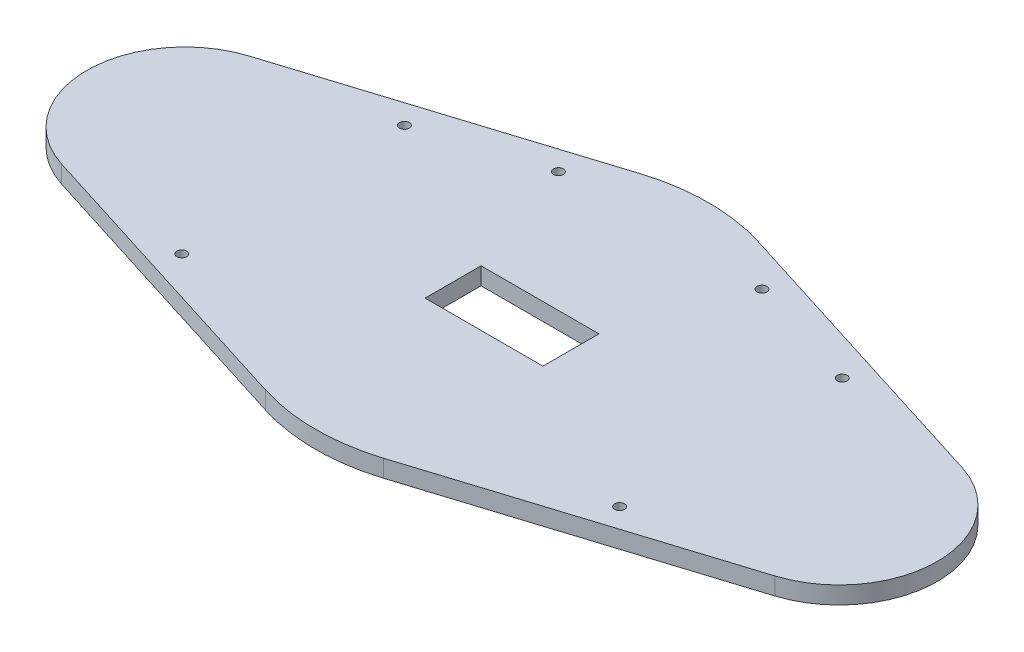
ISO-10303-21;
HEADER;
FILE_DESCRIPTION(('STEP AP214'),'2;1');
FILE_NAME('part.step','',(''),(''),'','','');
FILE_SCHEMA(('AUTOMOTIVE_DESIGN { 1 0 10303 214 1 1 1 1 }'));
ENDSEC;
DATA;
#1=APPLICATION_CONTEXT('core data for automotive mechanical design processes');
#2=APPLICATION_PROTOCOL_DEFINITION('international standard','automotive_design',2000,#1);
#3=PRODUCT_CONTEXT('',#1,'mechanical');
#4=PRODUCT('Part','Part','',(#3));
#5=PRODUCT_RELATED_PRODUCT_CATEGORY('part','',(#4));
#6=PRODUCT_DEFINITION_FORMATION('','',#4);
#7=PRODUCT_DEFINITION_CONTEXT('part definition',#1,'design');
#8=PRODUCT_DEFINITION('design','',#6,#7);
#9=PRODUCT_DEFINITION_SHAPE('','',#8);
#10=(LENGTH_UNIT() NAMED_UNIT(*) SI_UNIT(.MILLI.,.METRE.));
#11=(NAMED_UNIT(*) PLANE_ANGLE_UNIT() SI_UNIT($,.RADIAN.));
#12=(NAMED_UNIT(*) SI_UNIT($,.STERADIAN.) SOLID_ANGLE_UNIT());
#13=UNCERTAINTY_MEASURE_WITH_UNIT(LENGTH_MEASURE(1.E-05),#10,'distance_accuracy_value','');
#14=(GEOMETRIC_REPRESENTATION_CONTEXT(3) GLOBAL_UNCERTAINTY_ASSIGNED_CONTEXT((#13)) GLOBAL_UNIT_ASSIGNED_CONTEXT((#10,
#11,#12)) REPRESENTATION_CONTEXT('',''));
#15=CARTESIAN_POINT('',(0.,0.,0.));
#16=DIRECTION('',(0.,0.,1.));
#17=DIRECTION('',(1.,0.,0.));
#18=AXIS2_PLACEMENT_3D('',#15,#16,#17);
#19=CARTESIAN_POINT('',(-84.582,4.4958,0.));
#20=DIRECTION('',(0.,1.,0.));
#21=DIRECTION('',(0.,0.,1.));
#22=AXIS2_PLACEMENT_3D('',#19,#20,#21);
#23=PLANE('',#22);
#24=CARTESIAN_POINT('',(-26.3141059658633,4.4958,-38.3163692332314));
#25=DIRECTION('',(0.,1.,0.));
#26=DIRECTION('',(0.,0.,1.));
#27=AXIS2_PLACEMENT_3D('',#24,#25,#26);
#28=CIRCLE('',#27,1.27);
#29=CARTESIAN_POINT('',(-26.3141059658633,4.4958,-37.0463692332314));
#30=VERTEX_POINT('',#29);
#31=EDGE_CURVE('E327',#30,#30,#28,.T.);
#32=ORIENTED_EDGE('',*,*,#31,.F.);
#33=EDGE_LOOP('',(#32));
#34=FACE_BOUND('',#33,.T.);
#35=CARTESIAN_POINT('',(56.6033654962808,4.4958,28.7803581370082));
#36=DIRECTION('',(0.,1.,0.));
#37=DIRECTION('',(0.,0.,1.));
#38=AXIS2_PLACEMENT_3D('',#35,#36,#37);
#39=CIRCLE('',#38,1.27);
#40=CARTESIAN_POINT('',(56.6033654962808,4.4958,30.0503581370082));
#41=VERTEX_POINT('',#40);
#42=EDGE_CURVE('E339',#41,#41,#39,.T.);
#43=ORIENTED_EDGE('',*,*,#42,.F.);
#44=EDGE_LOOP('',(#43));
#45=FACE_BOUND('',#44,.T.);
#46=CARTESIAN_POINT('',(-56.6033654962808,4.4958,-28.7803581370082));
#47=DIRECTION('',(0.,1.,0.));
#48=DIRECTION('',(0.,0.,1.));
#49=AXIS2_PLACEMENT_3D('',#46,#47,#48);
#50=CIRCLE('',#49,1.27);
#51=CARTESIAN_POINT('',(-56.6033654962808,4.4958,-27.5103581370082));
#52=VERTEX_POINT('',#51);
#53=EDGE_CURVE('E151',#52,#52,#50,.T.);
#54=ORIENTED_EDGE('',*,*,#53,.F.);
#55=EDGE_LOOP('',(#54));
#56=FACE_BOUND('',#55,.T.);
#57=CARTESIAN_POINT('',(-84.582,4.4958,0.));
#58=DIRECTION('',(0.,1.,0.));
#59=DIRECTION('',(0.,0.,1.));
#60=AXIS2_PLACEMENT_3D('',#57,#58,#59);
#61=CIRCLE('',#60,25.4);
#62=CARTESIAN_POINT('',(-92.2096276276276,4.4958,-24.2276556186159));
#63=VERTEX_POINT('',#62);
#64=CARTESIAN_POINT('',(-92.2096276276276,4.4958,24.2276556186159));
#65=VERTEX_POINT('',#64);
#66=EDGE_CURVE('E161',#63,#65,#61,.T.);
#67=ORIENTED_EDGE('',*,*,#66,.T.);
#68=DIRECTION('',(0.953844709394328,0.,0.3003003003003));
#69=VECTOR('',#68,1.);
#70=CARTESIAN_POINT('',(-92.2096276276276,4.4958,24.2276556186159));
#71=LINE('',#70,#69);
#72=CARTESIAN_POINT('',(-15.2552552552553,4.4958,48.4553112372319));
#73=VERTEX_POINT('',#72);
#74=EDGE_CURVE('E164',#65,#73,#71,.T.);
#75=ORIENTED_EDGE('',*,*,#74,.T.);
#76=CARTESIAN_POINT('',(0.,4.4958,0.));
#77=DIRECTION('',(0.,1.,0.));
#78=DIRECTION('',(0.,0.,1.));
#79=AXIS2_PLACEMENT_3D('',#76,#77,#78);
#80=CIRCLE('',#79,50.8);
#81=CARTESIAN_POINT('',(15.2552552552553,4.4958,48.4553112372318));
#82=VERTEX_POINT('',#81);
#83=EDGE_CURVE('E167',#73,#82,#80,.T.);
#84=ORIENTED_EDGE('',*,*,#83,.T.);
#85=DIRECTION('',(0.953844709394328,0.,-0.3003003003003));
#86=VECTOR('',#85,1.);
#87=CARTESIAN_POINT('',(92.2096276276276,4.4958,24.2276556186159));
#88=LINE('',#87,#86);
#89=CARTESIAN_POINT('',(92.2096276276276,4.4958,24.2276556186159));
#90=VERTEX_POINT('',#89);
#91=EDGE_CURVE('E169',#82,#90,#88,.T.);
#92=ORIENTED_EDGE('',*,*,#91,.T.);
#93=CARTESIAN_POINT('',(84.582,4.4958,0.));
#94=DIRECTION('',(0.,1.,0.));
#95=DIRECTION('',(0.,0.,1.));
#96=AXIS2_PLACEMENT_3D('',#93,#94,#95);
#97=CIRCLE('',#96,25.4);
#98=CARTESIAN_POINT('',(92.2096276276276,4.4958,-24.2276556186159));
#99=VERTEX_POINT('',#98);
#100=EDGE_CURVE('E171',#90,#99,#97,.T.);
#101=ORIENTED_EDGE('',*,*,#100,.T.);
#102=DIRECTION('',(-0.953844709394328,0.,-0.3003003003003));
#103=VECTOR('',#102,1.);
#104=CARTESIAN_POINT('',(92.2096276276276,4.4958,-24.2276556186159));
#105=LINE('',#104,#103);
#106=CARTESIAN_POINT('',(15.2552552552552,4.4958,-48.4553112372318));
#107=VERTEX_POINT('',#106);
#108=EDGE_CURVE('E173',#99,#107,#105,.T.);
#109=ORIENTED_EDGE('',*,*,#108,.T.);
#110=CARTESIAN_POINT('',(0.,4.4958,0.));
#111=DIRECTION('',(0.,1.,0.));
#112=DIRECTION('',(0.,0.,1.));
#113=AXIS2_PLACEMENT_3D('',#110,#111,#112);
#114=CIRCLE('',#113,50.8);
#115=CARTESIAN_POINT('',(-15.2552552552553,4.4958,-48.4553112372319));
#116=VERTEX_POINT('',#115);
#117=EDGE_CURVE('E175',#107,#116,#114,.T.);
#118=ORIENTED_EDGE('',*,*,#117,.T.);
#119=DIRECTION('',(-0.953844709394328,0.,0.3003003003003));
#120=VECTOR('',#119,1.);
#121=CARTESIAN_POINT('',(-92.2096276276276,4.4958,-24.2276556186159));
#122=LINE('',#121,#120);
#123=EDGE_CURVE('E177',#116,#63,#122,.T.);
#124=ORIENTED_EDGE('',*,*,#123,.T.);
#125=EDGE_LOOP('',(#67,#75,#84,#92,#101,#109,#118,#124));
#126=FACE_BOUND('',#125,.T.);
#127=DIRECTION('',(1.,0.,0.));
#128=VECTOR('',#127,1.);
#129=CARTESIAN_POINT('',(-15.24,4.4958,7.239));
#130=LINE('',#129,#128);
#131=CARTESIAN_POINT('',(-15.24,4.4958,7.239));
#132=VERTEX_POINT('',#131);
#133=CARTESIAN_POINT('',(15.24,4.4958,7.239));
#134=VERTEX_POINT('',#133);
#135=EDGE_CURVE('E130',#132,#134,#130,.T.);
#136=ORIENTED_EDGE('',*,*,#135,.F.);
#137=DIRECTION('',(0.,0.,1.));
#138=VECTOR('',#137,1.);
#139=CARTESIAN_POINT('',(-15.24,4.4958,-7.239));
#140=LINE('',#139,#138);
#141=CARTESIAN_POINT('',(-15.24,4.4958,-7.239));
#142=VERTEX_POINT('',#141);
#143=EDGE_CURVE('E122',#142,#132,#140,.T.);
#144=ORIENTED_EDGE('',*,*,#143,.F.);
#145=DIRECTION('',(-1.,0.,0.));
#146=VECTOR('',#145,1.);
#147=CARTESIAN_POINT('',(-15.24,4.4958,-7.239));
#148=LINE('',#147,#146);
#149=CARTESIAN_POINT('',(15.24,4.4958,-7.239));
#150=VERTEX_POINT('',#149);
#151=EDGE_CURVE('E145',#150,#142,#148,.T.);
#152=ORIENTED_EDGE('',*,*,#151,.F.);
#153=DIRECTION('',(0.,0.,-1.));
#154=VECTOR('',#153,1.);
#155=CARTESIAN_POINT('',(15.24,4.4958,-7.239));
#156=LINE('',#155,#154);
#157=EDGE_CURVE('E143',#134,#150,#156,.T.);
#158=ORIENTED_EDGE('',*,*,#157,.F.);
#159=EDGE_LOOP('',(#136,#144,#152,#158));
#160=FACE_BOUND('',#159,.T.);
#161=CARTESIAN_POINT('',(-56.6033654962808,4.4958,28.7803581370082));
#162=DIRECTION('',(0.,1.,0.));
#163=DIRECTION('',(0.,0.,1.));
#164=AXIS2_PLACEMENT_3D('',#161,#162,#163);
#165=CIRCLE('',#164,1.27);
#166=CARTESIAN_POINT('',(-56.6033654962808,4.4958,30.0503581370082));
#167=VERTEX_POINT('',#166);
#168=EDGE_CURVE('E345',#167,#167,#165,.T.);
#169=ORIENTED_EDGE('',*,*,#168,.F.);
#170=EDGE_LOOP('',(#169));
#171=FACE_BOUND('',#170,.T.);
#172=CARTESIAN_POINT('',(56.6033654962808,4.4958,-28.7803581370082));
#173=DIRECTION('',(0.,1.,0.));
#174=DIRECTION('',(0.,0.,1.));
#175=AXIS2_PLACEMENT_3D('',#172,#173,#174);
#176=CIRCLE('',#175,1.27);
#177=CARTESIAN_POINT('',(56.6033654962808,4.4958,-27.5103581370082));
#178=VERTEX_POINT('',#177);
#179=EDGE_CURVE('E333',#178,#178,#176,.T.);
#180=ORIENTED_EDGE('',*,*,#179,.F.);
#181=EDGE_LOOP('',(#180));
#182=FACE_BOUND('',#181,.T.);
#183=CARTESIAN_POINT('',(26.3141059658633,4.4958,-38.3163692332314));
#184=DIRECTION('',(0.,1.,0.));
#185=DIRECTION('',(0.,0.,1.));
#186=AXIS2_PLACEMENT_3D('',#183,#184,#185);
#187=CIRCLE('',#186,1.27);
#188=CARTESIAN_POINT('',(26.3141059658633,4.4958,-37.0463692332314));
#189=VERTEX_POINT('',#188);
#190=EDGE_CURVE('E318',#189,#189,#187,.T.);
#191=ORIENTED_EDGE('',*,*,#190,.F.);
#192=EDGE_LOOP('',(#191));
#193=FACE_BOUND('',#192,.T.);
#194=ADVANCED_FACE('F33',(#34,#45,#56,#126,#160,#171,#182,#193),#23,.T.);
#195=CARTESIAN_POINT('',(-84.582,0.,0.));
#196=DIRECTION('',(0.,1.,0.));
#197=DIRECTION('',(0.,0.,1.));
#198=AXIS2_PLACEMENT_3D('',#195,#196,#197);
#199=PLANE('',#198);
#200=CARTESIAN_POINT('',(-84.582,0.,0.));
#201=DIRECTION('',(0.,1.,0.));
#202=DIRECTION('',(0.,0.,1.));
#203=AXIS2_PLACEMENT_3D('',#200,#201,#202);
#204=CIRCLE('',#203,25.4);
#205=CARTESIAN_POINT('',(-92.2096276276276,0.,-24.2276556186159));
#206=VERTEX_POINT('',#205);
#207=CARTESIAN_POINT('',(-92.2096276276276,0.,24.2276556186159));
#208=VERTEX_POINT('',#207);
#209=EDGE_CURVE('E138',#206,#208,#204,.T.);
#210=ORIENTED_EDGE('',*,*,#209,.F.);
#211=DIRECTION('',(-0.953844709394328,0.,0.3003003003003));
#212=VECTOR('',#211,1.);
#213=CARTESIAN_POINT('',(-92.2096276276276,0.,-24.2276556186159));
#214=LINE('',#213,#212);
#215=CARTESIAN_POINT('',(-15.2552552552553,0.,-48.4553112372319));
#216=VERTEX_POINT('',#215);
#217=EDGE_CURVE('E165',#216,#206,#214,.T.);
#218=ORIENTED_EDGE('',*,*,#217,.F.);
#219=CARTESIAN_POINT('',(0.,0.,0.));
#220=DIRECTION('',(0.,1.,0.));
#221=DIRECTION('',(0.,0.,1.));
#222=AXIS2_PLACEMENT_3D('',#219,#220,#221);
#223=CIRCLE('',#222,50.8);
#224=CARTESIAN_POINT('',(15.2552552552552,0.,-48.4553112372318));
#225=VERTEX_POINT('',#224);
#226=EDGE_CURVE('E192',#225,#216,#223,.T.);
#227=ORIENTED_EDGE('',*,*,#226,.F.);
#228=DIRECTION('',(-0.953844709394328,0.,-0.3003003003003));
#229=VECTOR('',#228,1.);
#230=CARTESIAN_POINT('',(92.2096276276276,0.,-24.2276556186159));
#231=LINE('',#230,#229);
#232=CARTESIAN_POINT('',(92.2096276276276,0.,-24.2276556186159));
#233=VERTEX_POINT('',#232);
#234=EDGE_CURVE('E190',#233,#225,#231,.T.);
#235=ORIENTED_EDGE('',*,*,#234,.F.);
#236=CARTESIAN_POINT('',(84.582,0.,0.));
#237=DIRECTION('',(0.,1.,0.));
#238=DIRECTION('',(0.,0.,1.));
#239=AXIS2_PLACEMENT_3D('',#236,#237,#238);
#240=CIRCLE('',#239,25.4);
#241=CARTESIAN_POINT('',(92.2096276276276,0.,24.2276556186159));
#242=VERTEX_POINT('',#241);
#243=EDGE_CURVE('E188',#242,#233,#240,.T.);
#244=ORIENTED_EDGE('',*,*,#243,.F.);
#245=DIRECTION('',(0.953844709394328,0.,-0.3003003003003));
#246=VECTOR('',#245,1.);
#247=CARTESIAN_POINT('',(92.2096276276276,0.,24.2276556186159));
#248=LINE('',#247,#246);
#249=CARTESIAN_POINT('',(15.2552552552553,0.,48.4553112372318));
#250=VERTEX_POINT('',#249);
#251=EDGE_CURVE('E186',#250,#242,#248,.T.);
#252=ORIENTED_EDGE('',*,*,#251,.F.);
#253=CARTESIAN_POINT('',(0.,0.,0.));
#254=DIRECTION('',(0.,1.,0.));
#255=DIRECTION('',(0.,0.,1.));
#256=AXIS2_PLACEMENT_3D('',#253,#254,#255);
#257=CIRCLE('',#256,50.8);
#258=CARTESIAN_POINT('',(-15.2552552552553,0.,48.4553112372319));
#259=VERTEX_POINT('',#258);
#260=EDGE_CURVE('E184',#259,#250,#257,.T.);
#261=ORIENTED_EDGE('',*,*,#260,.F.);
#262=DIRECTION('',(0.953844709394328,0.,0.3003003003003));
#263=VECTOR('',#262,1.);
#264=CARTESIAN_POINT('',(-92.2096276276276,0.,24.2276556186159));
#265=LINE('',#264,#263);
#266=EDGE_CURVE('E182',#208,#259,#265,.T.);
#267=ORIENTED_EDGE('',*,*,#266,.F.);
#268=EDGE_LOOP('',(#210,#218,#227,#235,#244,#252,#261,#267));
#269=FACE_BOUND('',#268,.T.);
#270=DIRECTION('',(0.,0.,1.));
#271=VECTOR('',#270,1.);
#272=CARTESIAN_POINT('',(-15.24,0.,-7.239));
#273=LINE('',#272,#271);
#274=CARTESIAN_POINT('',(-15.24,0.,-7.239));
#275=VERTEX_POINT('',#274);
#276=CARTESIAN_POINT('',(-15.24,0.,7.239));
#277=VERTEX_POINT('',#276);
#278=EDGE_CURVE('E56',#275,#277,#273,.T.);
#279=ORIENTED_EDGE('',*,*,#278,.T.);
#280=DIRECTION('',(1.,0.,0.));
#281=VECTOR('',#280,1.);
#282=CARTESIAN_POINT('',(-15.24,0.,7.239));
#283=LINE('',#282,#281);
#284=CARTESIAN_POINT('',(15.24,0.,7.239));
#285=VERTEX_POINT('',#284);
#286=EDGE_CURVE('E137',#277,#285,#283,.T.);
#287=ORIENTED_EDGE('',*,*,#286,.T.);
#288=DIRECTION('',(0.,0.,-1.));
#289=VECTOR('',#288,1.);
#290=CARTESIAN_POINT('',(15.24,0.,-7.239));
#291=LINE('',#290,#289);
#292=CARTESIAN_POINT('',(15.24,0.,-7.239));
#293=VERTEX_POINT('',#292);
#294=EDGE_CURVE('E153',#285,#293,#291,.T.);
#295=ORIENTED_EDGE('',*,*,#294,.T.);
#296=DIRECTION('',(-1.,0.,0.));
#297=VECTOR('',#296,1.);
#298=CARTESIAN_POINT('',(-15.24,0.,-7.239));
#299=LINE('',#298,#297);
#300=EDGE_CURVE('E131',#293,#275,#299,.T.);
#301=ORIENTED_EDGE('',*,*,#300,.T.);
#302=EDGE_LOOP('',(#279,#287,#295,#301));
#303=FACE_BOUND('',#302,.T.);
#304=CARTESIAN_POINT('',(-56.6033654962808,0.,-28.7803581370082));
#305=DIRECTION('',(0.,1.,0.));
#306=DIRECTION('',(0.,0.,1.));
#307=AXIS2_PLACEMENT_3D('',#304,#305,#306);
#308=CIRCLE('',#307,1.27);
#309=CARTESIAN_POINT('',(-56.6033654962808,0.,-27.5103581370082));
#310=VERTEX_POINT('',#309);
#311=EDGE_CURVE('E348',#310,#310,#308,.T.);
#312=ORIENTED_EDGE('',*,*,#311,.T.);
#313=EDGE_LOOP('',(#312));
#314=FACE_BOUND('',#313,.T.);
#315=CARTESIAN_POINT('',(-56.6033654962808,0.,28.7803581370082));
#316=DIRECTION('',(0.,1.,0.));
#317=DIRECTION('',(0.,0.,1.));
#318=AXIS2_PLACEMENT_3D('',#315,#316,#317);
#319=CIRCLE('',#318,1.27);
#320=CARTESIAN_POINT('',(-56.6033654962808,0.,30.0503581370082));
#321=VERTEX_POINT('',#320);
#322=EDGE_CURVE('E342',#321,#321,#319,.T.);
#323=ORIENTED_EDGE('',*,*,#322,.T.);
#324=EDGE_LOOP('',(#323));
#325=FACE_BOUND('',#324,.T.);
#326=CARTESIAN_POINT('',(56.6033654962808,0.,28.7803581370082));
#327=DIRECTION('',(0.,1.,0.));
#328=DIRECTION('',(0.,0.,1.));
#329=AXIS2_PLACEMENT_3D('',#326,#327,#328);
#330=CIRCLE('',#329,1.27);
#331=CARTESIAN_POINT('',(56.6033654962808,0.,30.0503581370082));
#332=VERTEX_POINT('',#331);
#333=EDGE_CURVE('E336',#332,#332,#330,.T.);
#334=ORIENTED_EDGE('',*,*,#333,.T.);
#335=EDGE_LOOP('',(#334));
#336=FACE_BOUND('',#335,.T.);
#337=CARTESIAN_POINT('',(56.6033654962808,0.,-28.7803581370082));
#338=DIRECTION('',(0.,1.,0.));
#339=DIRECTION('',(0.,0.,1.));
#340=AXIS2_PLACEMENT_3D('',#337,#338,#339);
#341=CIRCLE('',#340,1.27);
#342=CARTESIAN_POINT('',(56.6033654962808,0.,-27.5103581370082));
#343=VERTEX_POINT('',#342);
#344=EDGE_CURVE('E330',#343,#343,#341,.T.);
#345=ORIENTED_EDGE('',*,*,#344,.T.);
#346=EDGE_LOOP('',(#345));
#347=FACE_BOUND('',#346,.T.);
#348=CARTESIAN_POINT('',(-26.3141059658633,0.,-38.3163692332314));
#349=DIRECTION('',(0.,1.,0.));
#350=DIRECTION('',(0.,0.,1.));
#351=AXIS2_PLACEMENT_3D('',#348,#349,#350);
#352=CIRCLE('',#351,1.27);
#353=CARTESIAN_POINT('',(-26.3141059658633,0.,-37.0463692332314));
#354=VERTEX_POINT('',#353);
#355=EDGE_CURVE('E324',#354,#354,#352,.T.);
#356=ORIENTED_EDGE('',*,*,#355,.T.);
#357=EDGE_LOOP('',(#356));
#358=FACE_BOUND('',#357,.T.);
#359=CARTESIAN_POINT('',(26.3141059658633,0.,-38.3163692332314));
#360=DIRECTION('',(0.,1.,0.));
#361=DIRECTION('',(0.,0.,1.));
#362=AXIS2_PLACEMENT_3D('',#359,#360,#361);
#363=CIRCLE('',#362,1.27);
#364=CARTESIAN_POINT('',(26.3141059658633,0.,-37.0463692332314));
#365=VERTEX_POINT('',#364);
#366=EDGE_CURVE('E321',#365,#365,#363,.T.);
#367=ORIENTED_EDGE('',*,*,#366,.T.);
#368=EDGE_LOOP('',(#367));
#369=FACE_BOUND('',#368,.T.);
#370=ADVANCED_FACE('F222',(#269,#303,#314,#325,#336,#347,#358,#369),#199,.F.);
#371=CARTESIAN_POINT('',(-84.582,4.4958,0.));
#372=DIRECTION('',(0.,-1.,0.));
#373=DIRECTION('',(0.,0.,-1.));
#374=AXIS2_PLACEMENT_3D('',#371,#372,#373);
#375=CYLINDRICAL_SURFACE('',#374,25.4);
#376=ORIENTED_EDGE('',*,*,#209,.T.);
#377=DIRECTION('',(0.,-1.,0.));
#378=VECTOR('',#377,1.);
#379=CARTESIAN_POINT('',(-92.2096276276276,4.4958,24.2276556186159));
#380=LINE('',#379,#378);
#381=EDGE_CURVE('E11',#65,#208,#380,.T.);
#382=ORIENTED_EDGE('',*,*,#381,.F.);
#383=ORIENTED_EDGE('',*,*,#66,.F.);
#384=DIRECTION('',(0.,-1.,0.));
#385=VECTOR('',#384,1.);
#386=CARTESIAN_POINT('',(-92.2096276276276,4.4958,-24.2276556186159));
#387=LINE('',#386,#385);
#388=EDGE_CURVE('E179',#63,#206,#387,.T.);
#389=ORIENTED_EDGE('',*,*,#388,.T.);
#390=EDGE_LOOP('',(#376,#382,#383,#389));
#391=FACE_BOUND('',#390,.T.);
#392=ADVANCED_FACE('F35',(#391),#375,.T.);
#393=CARTESIAN_POINT('',(-92.2096276276276,4.4958,24.2276556186159));
#394=DIRECTION('',(0.3003003003003,0.,-0.953844709394328));
#395=DIRECTION('',(-0.953844709394328,0.,-0.3003003003003));
#396=AXIS2_PLACEMENT_3D('',#393,#394,#395);
#397=PLANE('',#396);
#398=ORIENTED_EDGE('',*,*,#266,.T.);
#399=DIRECTION('',(0.,-1.,0.));
#400=VECTOR('',#399,1.);
#401=CARTESIAN_POINT('',(-15.2552552552553,4.4958,48.4553112372319));
#402=LINE('',#401,#400);
#403=EDGE_CURVE('E41',#73,#259,#402,.T.);
#404=ORIENTED_EDGE('',*,*,#403,.F.);
#405=ORIENTED_EDGE('',*,*,#74,.F.);
#406=ORIENTED_EDGE('',*,*,#381,.T.);
#407=EDGE_LOOP('',(#398,#404,#405,#406));
#408=FACE_BOUND('',#407,.T.);
#409=ADVANCED_FACE('F239',(#408),#397,.F.);
#410=CARTESIAN_POINT('',(0.,4.4958,0.));
#411=DIRECTION('',(0.,-1.,0.));
#412=DIRECTION('',(0.,0.,-1.));
#413=AXIS2_PLACEMENT_3D('',#410,#411,#412);
#414=CYLINDRICAL_SURFACE('',#413,50.8);
#415=ORIENTED_EDGE('',*,*,#260,.T.);
#416=DIRECTION('',(0.,-1.,0.));
#417=VECTOR('',#416,1.);
#418=CARTESIAN_POINT('',(15.2552552552553,4.4958,48.4553112372318));
#419=LINE('',#418,#417);
#420=EDGE_CURVE('E209',#82,#250,#419,.T.);
#421=ORIENTED_EDGE('',*,*,#420,.F.);
#422=ORIENTED_EDGE('',*,*,#83,.F.);
#423=ORIENTED_EDGE('',*,*,#403,.T.);
#424=EDGE_LOOP('',(#415,#421,#422,#423));
#425=FACE_BOUND('',#424,.T.);
#426=ADVANCED_FACE('F216',(#425),#414,.T.);
#427=CARTESIAN_POINT('',(92.2096276276276,4.4958,24.2276556186159));
#428=DIRECTION('',(-0.3003003003003,0.,-0.953844709394328));
#429=DIRECTION('',(-0.953844709394328,0.,0.3003003003003));
#430=AXIS2_PLACEMENT_3D('',#427,#428,#429);
#431=PLANE('',#430);
#432=ORIENTED_EDGE('',*,*,#251,.T.);
#433=DIRECTION('',(0.,-1.,0.));
#434=VECTOR('',#433,1.);
#435=CARTESIAN_POINT('',(92.2096276276276,4.4958,24.2276556186159));
#436=LINE('',#435,#434);
#437=EDGE_CURVE('E206',#90,#242,#436,.T.);
#438=ORIENTED_EDGE('',*,*,#437,.F.);
#439=ORIENTED_EDGE('',*,*,#91,.F.);
#440=ORIENTED_EDGE('',*,*,#420,.T.);
#441=EDGE_LOOP('',(#432,#438,#439,#440));
#442=FACE_BOUND('',#441,.T.);
#443=ADVANCED_FACE('F228',(#442),#431,.F.);
#444=CARTESIAN_POINT('',(84.582,4.4958,0.));
#445=DIRECTION('',(0.,-1.,0.));
#446=DIRECTION('',(0.,0.,-1.));
#447=AXIS2_PLACEMENT_3D('',#444,#445,#446);
#448=CYLINDRICAL_SURFACE('',#447,25.4);
#449=ORIENTED_EDGE('',*,*,#243,.T.);
#450=DIRECTION('',(0.,-1.,0.));
#451=VECTOR('',#450,1.);
#452=CARTESIAN_POINT('',(92.2096276276276,4.4958,-24.2276556186159));
#453=LINE('',#452,#451);
#454=EDGE_CURVE('E203',#99,#233,#453,.T.);
#455=ORIENTED_EDGE('',*,*,#454,.F.);
#456=ORIENTED_EDGE('',*,*,#100,.F.);
#457=ORIENTED_EDGE('',*,*,#437,.T.);
#458=EDGE_LOOP('',(#449,#455,#456,#457));
#459=FACE_BOUND('',#458,.T.);
#460=ADVANCED_FACE('F232',(#459),#448,.T.);
#461=CARTESIAN_POINT('',(92.2096276276276,4.4958,-24.2276556186159));
#462=DIRECTION('',(-0.3003003003003,0.,0.953844709394328));
#463=DIRECTION('',(0.953844709394328,0.,0.3003003003003));
#464=AXIS2_PLACEMENT_3D('',#461,#462,#463);
#465=PLANE('',#464);
#466=ORIENTED_EDGE('',*,*,#234,.T.);
#467=DIRECTION('',(0.,-1.,0.));
#468=VECTOR('',#467,1.);
#469=CARTESIAN_POINT('',(15.2552552552552,4.4958,-48.4553112372318));
#470=LINE('',#469,#468);
#471=EDGE_CURVE('E200',#107,#225,#470,.T.);
#472=ORIENTED_EDGE('',*,*,#471,.F.);
#473=ORIENTED_EDGE('',*,*,#108,.F.);
#474=ORIENTED_EDGE('',*,*,#454,.T.);
#475=EDGE_LOOP('',(#466,#472,#473,#474));
#476=FACE_BOUND('',#475,.T.);
#477=ADVANCED_FACE('F252',(#476),#465,.F.);
#478=CARTESIAN_POINT('',(0.,4.4958,0.));
#479=DIRECTION('',(0.,-1.,0.));
#480=DIRECTION('',(0.,0.,-1.));
#481=AXIS2_PLACEMENT_3D('',#478,#479,#480);
#482=CYLINDRICAL_SURFACE('',#481,50.8);
#483=ORIENTED_EDGE('',*,*,#226,.T.);
#484=DIRECTION('',(0.,-1.,0.));
#485=VECTOR('',#484,1.);
#486=CARTESIAN_POINT('',(-15.2552552552553,4.4958,-48.4553112372319));
#487=LINE('',#486,#485);
#488=EDGE_CURVE('E197',#116,#216,#487,.T.);
#489=ORIENTED_EDGE('',*,*,#488,.F.);
#490=ORIENTED_EDGE('',*,*,#117,.F.);
#491=ORIENTED_EDGE('',*,*,#471,.T.);
#492=EDGE_LOOP('',(#483,#489,#490,#491));
#493=FACE_BOUND('',#492,.T.);
#494=ADVANCED_FACE('F250',(#493),#482,.T.);
#495=CARTESIAN_POINT('',(-92.2096276276276,4.4958,-24.2276556186159));
#496=DIRECTION('',(0.3003003003003,0.,0.953844709394328));
#497=DIRECTION('',(0.953844709394328,0.,-0.3003003003003));
#498=AXIS2_PLACEMENT_3D('',#495,#496,#497);
#499=PLANE('',#498);
#500=ORIENTED_EDGE('',*,*,#217,.T.);
#501=ORIENTED_EDGE('',*,*,#388,.F.);
#502=ORIENTED_EDGE('',*,*,#123,.F.);
#503=ORIENTED_EDGE('',*,*,#488,.T.);
#504=EDGE_LOOP('',(#500,#501,#502,#503));
#505=FACE_BOUND('',#504,.T.);
#506=ADVANCED_FACE('F245',(#505),#499,.F.);
#507=CARTESIAN_POINT('',(-15.24,4.4958,-7.239));
#508=DIRECTION('',(1.,0.,0.));
#509=DIRECTION('',(0.,0.,-1.));
#510=AXIS2_PLACEMENT_3D('',#507,#508,#509);
#511=PLANE('',#510);
#512=ORIENTED_EDGE('',*,*,#278,.F.);
#513=DIRECTION('',(0.,-1.,0.));
#514=VECTOR('',#513,1.);
#515=CARTESIAN_POINT('',(-15.24,4.4958,-7.239));
#516=LINE('',#515,#514);
#517=EDGE_CURVE('E126',#142,#275,#516,.T.);
#518=ORIENTED_EDGE('',*,*,#517,.F.);
#519=ORIENTED_EDGE('',*,*,#143,.T.);
#520=DIRECTION('',(0.,-1.,0.));
#521=VECTOR('',#520,1.);
#522=CARTESIAN_POINT('',(-15.24,4.4958,7.239));
#523=LINE('',#522,#521);
#524=EDGE_CURVE('E125',#132,#277,#523,.T.);
#525=ORIENTED_EDGE('',*,*,#524,.T.);
#526=EDGE_LOOP('',(#512,#518,#519,#525));
#527=FACE_BOUND('',#526,.T.);
#528=ADVANCED_FACE('F124',(#527),#511,.T.);
#529=CARTESIAN_POINT('',(-15.24,4.4958,7.239));
#530=DIRECTION('',(0.,0.,-1.));
#531=DIRECTION('',(-1.,0.,0.));
#532=AXIS2_PLACEMENT_3D('',#529,#530,#531);
#533=PLANE('',#532);
#534=ORIENTED_EDGE('',*,*,#286,.F.);
#535=ORIENTED_EDGE('',*,*,#524,.F.);
#536=ORIENTED_EDGE('',*,*,#135,.T.);
#537=DIRECTION('',(0.,-1.,0.));
#538=VECTOR('',#537,1.);
#539=CARTESIAN_POINT('',(15.24,4.4958,7.239));
#540=LINE('',#539,#538);
#541=EDGE_CURVE('E139',#134,#285,#540,.T.);
#542=ORIENTED_EDGE('',*,*,#541,.T.);
#543=EDGE_LOOP('',(#534,#535,#536,#542));
#544=FACE_BOUND('',#543,.T.);
#545=ADVANCED_FACE('F134',(#544),#533,.T.);
#546=CARTESIAN_POINT('',(15.24,4.4958,-7.239));
#547=DIRECTION('',(-1.,0.,0.));
#548=DIRECTION('',(0.,0.,1.));
#549=AXIS2_PLACEMENT_3D('',#546,#547,#548);
#550=PLANE('',#549);
#551=ORIENTED_EDGE('',*,*,#294,.F.);
#552=ORIENTED_EDGE('',*,*,#541,.F.);
#553=ORIENTED_EDGE('',*,*,#157,.T.);
#554=DIRECTION('',(0.,-1.,0.));
#555=VECTOR('',#554,1.);
#556=CARTESIAN_POINT('',(15.24,4.4958,-7.239));
#557=LINE('',#556,#555);
#558=EDGE_CURVE('E48',#150,#293,#557,.T.);
#559=ORIENTED_EDGE('',*,*,#558,.T.);
#560=EDGE_LOOP('',(#551,#552,#553,#559));
#561=FACE_BOUND('',#560,.T.);
#562=ADVANCED_FACE('F280',(#561),#550,.T.);
#563=CARTESIAN_POINT('',(-15.24,4.4958,-7.239));
#564=DIRECTION('',(0.,0.,1.));
#565=DIRECTION('',(1.,0.,0.));
#566=AXIS2_PLACEMENT_3D('',#563,#564,#565);
#567=PLANE('',#566);
#568=ORIENTED_EDGE('',*,*,#300,.F.);
#569=ORIENTED_EDGE('',*,*,#558,.F.);
#570=ORIENTED_EDGE('',*,*,#151,.T.);
#571=ORIENTED_EDGE('',*,*,#517,.T.);
#572=EDGE_LOOP('',(#568,#569,#570,#571));
#573=FACE_BOUND('',#572,.T.);
#574=ADVANCED_FACE('F284',(#573),#567,.T.);
#575=CARTESIAN_POINT('',(-56.6033654962808,4.4958,-28.7803581370082));
#576=DIRECTION('',(0.,-1.,0.));
#577=DIRECTION('',(0.,0.,-1.));
#578=AXIS2_PLACEMENT_3D('',#575,#576,#577);
#579=CYLINDRICAL_SURFACE('',#578,1.27);
#580=ORIENTED_EDGE('',*,*,#53,.T.);
#581=EDGE_LOOP('',(#580));
#582=FACE_BOUND('',#581,.T.);
#583=ORIENTED_EDGE('',*,*,#311,.F.);
#584=EDGE_LOOP('',(#583));
#585=FACE_BOUND('',#584,.T.);
#586=ADVANCED_FACE('F290',(#582,#585),#579,.F.);
#587=CARTESIAN_POINT('',(-56.6033654962808,4.4958,28.7803581370082));
#588=DIRECTION('',(0.,-1.,0.));
#589=DIRECTION('',(0.,0.,-1.));
#590=AXIS2_PLACEMENT_3D('',#587,#588,#589);
#591=CYLINDRICAL_SURFACE('',#590,1.27);
#592=ORIENTED_EDGE('',*,*,#168,.T.);
#593=EDGE_LOOP('',(#592));
#594=FACE_BOUND('',#593,.T.);
#595=ORIENTED_EDGE('',*,*,#322,.F.);
#596=EDGE_LOOP('',(#595));
#597=FACE_BOUND('',#596,.T.);
#598=ADVANCED_FACE('F293',(#594,#597),#591,.F.);
#599=CARTESIAN_POINT('',(56.6033654962808,4.4958,28.7803581370082));
#600=DIRECTION('',(0.,-1.,0.));
#601=DIRECTION('',(0.,0.,-1.));
#602=AXIS2_PLACEMENT_3D('',#599,#600,#601);
#603=CYLINDRICAL_SURFACE('',#602,1.27);
#604=ORIENTED_EDGE('',*,*,#42,.T.);
#605=EDGE_LOOP('',(#604));
#606=FACE_BOUND('',#605,.T.);
#607=ORIENTED_EDGE('',*,*,#333,.F.);
#608=EDGE_LOOP('',(#607));
#609=FACE_BOUND('',#608,.T.);
#610=ADVANCED_FACE('F297',(#606,#609),#603,.F.);
#611=CARTESIAN_POINT('',(56.6033654962808,4.4958,-28.7803581370082));
#612=DIRECTION('',(0.,-1.,0.));
#613=DIRECTION('',(0.,0.,-1.));
#614=AXIS2_PLACEMENT_3D('',#611,#612,#613);
#615=CYLINDRICAL_SURFACE('',#614,1.27);
#616=ORIENTED_EDGE('',*,*,#179,.T.);
#617=EDGE_LOOP('',(#616));
#618=FACE_BOUND('',#617,.T.);
#619=ORIENTED_EDGE('',*,*,#344,.F.);
#620=EDGE_LOOP('',(#619));
#621=FACE_BOUND('',#620,.T.);
#622=ADVANCED_FACE('F301',(#618,#621),#615,.F.);
#623=CARTESIAN_POINT('',(-26.3141059658633,4.4958,-38.3163692332314));
#624=DIRECTION('',(0.,-1.,0.));
#625=DIRECTION('',(0.,0.,-1.));
#626=AXIS2_PLACEMENT_3D('',#623,#624,#625);
#627=CYLINDRICAL_SURFACE('',#626,1.27);
#628=ORIENTED_EDGE('',*,*,#31,.T.);
#629=EDGE_LOOP('',(#628));
#630=FACE_BOUND('',#629,.T.);
#631=ORIENTED_EDGE('',*,*,#355,.F.);
#632=EDGE_LOOP('',(#631));
#633=FACE_BOUND('',#632,.T.);
#634=ADVANCED_FACE('F305',(#630,#633),#627,.F.);
#635=CARTESIAN_POINT('',(26.3141059658633,4.4958,-38.3163692332314));
#636=DIRECTION('',(0.,-1.,0.));
#637=DIRECTION('',(0.,0.,-1.));
#638=AXIS2_PLACEMENT_3D('',#635,#636,#637);
#639=CYLINDRICAL_SURFACE('',#638,1.27);
#640=ORIENTED_EDGE('',*,*,#190,.T.);
#641=EDGE_LOOP('',(#640));
#642=FACE_BOUND('',#641,.T.);
#643=ORIENTED_EDGE('',*,*,#366,.F.);
#644=EDGE_LOOP('',(#643));
#645=FACE_BOUND('',#644,.T.);
#646=ADVANCED_FACE('F309',(#642,#645),#639,.F.);
#647=CLOSED_SHELL('',(#194,#370,#392,#409,#426,#443,#460,#477,#494,#506,#528,#545,#562,#574,
#586,#598,#610,#622,#634,#646));
#648=MANIFOLD_SOLID_BREP('B2',#647);
#649=ADVANCED_BREP_SHAPE_REPRESENTATION('',(#18,#648),#14);
#650=SHAPE_DEFINITION_REPRESENTATION(#9,#649);
ENDSEC;
END-ISO-10303-21;
